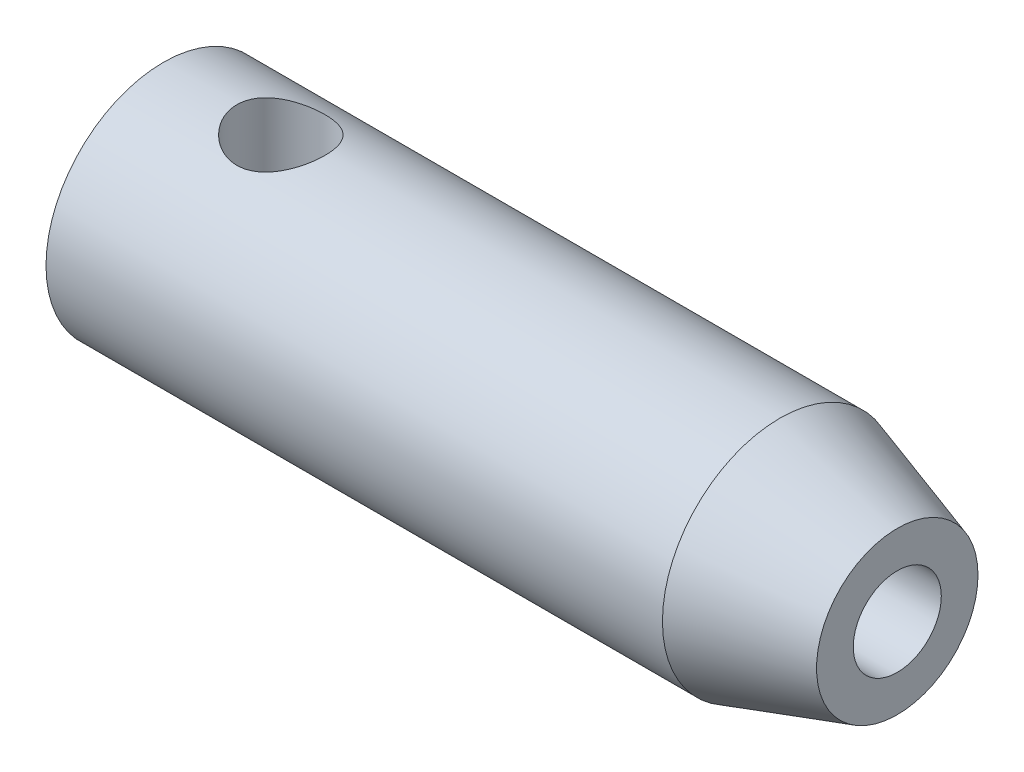
ISO-10303-21;
HEADER;
FILE_DESCRIPTION(('STEP AP214'),'2;1');
FILE_NAME('part.step','',(''),(''),'','','');
FILE_SCHEMA(('AUTOMOTIVE_DESIGN { 1 0 10303 214 1 1 1 1 }'));
ENDSEC;
DATA;
#1=APPLICATION_CONTEXT('core data for automotive mechanical design processes');
#2=APPLICATION_PROTOCOL_DEFINITION('international standard','automotive_design',2000,#1);
#3=PRODUCT_CONTEXT('',#1,'mechanical');
#4=PRODUCT('Part','Part','',(#3));
#5=PRODUCT_RELATED_PRODUCT_CATEGORY('part','',(#4));
#6=PRODUCT_DEFINITION_FORMATION('','',#4);
#7=PRODUCT_DEFINITION_CONTEXT('part definition',#1,'design');
#8=PRODUCT_DEFINITION('design','',#6,#7);
#9=PRODUCT_DEFINITION_SHAPE('','',#8);
#10=(LENGTH_UNIT() NAMED_UNIT(*) SI_UNIT(.MILLI.,.METRE.));
#11=(NAMED_UNIT(*) PLANE_ANGLE_UNIT() SI_UNIT($,.RADIAN.));
#12=(NAMED_UNIT(*) SI_UNIT($,.STERADIAN.) SOLID_ANGLE_UNIT());
#13=UNCERTAINTY_MEASURE_WITH_UNIT(LENGTH_MEASURE(1.E-05),#10,'distance_accuracy_value','');
#14=(GEOMETRIC_REPRESENTATION_CONTEXT(3) GLOBAL_UNCERTAINTY_ASSIGNED_CONTEXT((#13)) GLOBAL_UNIT_ASSIGNED_CONTEXT((#10,
#11,#12)) REPRESENTATION_CONTEXT('',''));
#15=CARTESIAN_POINT('',(0.,0.,0.));
#16=DIRECTION('',(0.,0.,1.));
#17=DIRECTION('',(1.,0.,0.));
#18=AXIS2_PLACEMENT_3D('',#15,#16,#17);
#19=CARTESIAN_POINT('',(25.,0.,0.));
#20=DIRECTION('',(1.,0.,0.));
#21=DIRECTION('',(0.,0.,-1.));
#22=AXIS2_PLACEMENT_3D('',#19,#20,#21);
#23=CYLINDRICAL_SURFACE('',#22,4.);
#24=CARTESIAN_POINT('',(21.,0.,0.));
#25=DIRECTION('',(1.,0.,0.));
#26=DIRECTION('',(0.,0.,-1.));
#27=AXIS2_PLACEMENT_3D('',#24,#25,#26);
#28=CIRCLE('',#27,4.);
#29=CARTESIAN_POINT('',(21.,0.,-4.));
#30=VERTEX_POINT('',#29);
#31=EDGE_CURVE('E84',#30,#30,#28,.T.);
#32=ORIENTED_EDGE('',*,*,#31,.F.);
#33=EDGE_LOOP('',(#32));
#34=FACE_BOUND('',#33,.T.);
#35=CARTESIAN_POINT('',(0.,0.,0.));
#36=DIRECTION('',(1.,0.,0.));
#37=DIRECTION('',(0.,0.,-1.));
#38=AXIS2_PLACEMENT_3D('',#35,#36,#37);
#39=CIRCLE('',#38,4.);
#40=CARTESIAN_POINT('',(0.,0.,-4.));
#41=VERTEX_POINT('',#40);
#42=EDGE_CURVE('E51',#41,#41,#39,.T.);
#43=ORIENTED_EDGE('',*,*,#42,.T.);
#44=EDGE_LOOP('',(#43));
#45=FACE_BOUND('',#44,.T.);
#46=CARTESIAN_POINT('',(4.,3.70809924354783,-1.5));
#47=CARTESIAN_POINT('',(3.91899251627921,3.70809640633806,-1.50000304106109));
#48=CARTESIAN_POINT('',(3.83800507749636,3.71078260240986,-1.49341597549487));
#49=CARTESIAN_POINT('',(3.6784719170868,3.72116159304967,-1.46736187895468));
#50=CARTESIAN_POINT('',(3.59992612240499,3.72885423767112,-1.44789523373263));
#51=CARTESIAN_POINT('',(3.44762462838647,3.748254802809,-1.39689657610574));
#52=CARTESIAN_POINT('',(3.37385794334892,3.7599530956926,-1.36539347266348));
#53=CARTESIAN_POINT('',(3.23262810318116,3.78603134206598,-1.29131856742698));
#54=CARTESIAN_POINT('',(3.16516684971748,3.80041210067323,-1.24874344095039));
#55=CARTESIAN_POINT('',(3.03510968837718,3.83103574665713,-1.15146661374162));
#56=CARTESIAN_POINT('',(2.97287147037061,3.84733341923603,-1.09630381213306));
#57=CARTESIAN_POINT('',(2.85827718532851,3.87949750628547,-0.976395839778926));
#58=CARTESIAN_POINT('',(2.80592322625815,3.89536382814785,-0.911648630256679));
#59=CARTESIAN_POINT('',(2.71086048770439,3.92552873936553,-0.7716946551776));
#60=CARTESIAN_POINT('',(2.66854052528414,3.93975561223505,-0.696206947538027));
#61=CARTESIAN_POINT('',(2.59734882747509,3.96438007973848,-0.538555771965247));
#62=CARTESIAN_POINT('',(2.56847242800803,3.97477900217006,-0.456394630933535));
#63=CARTESIAN_POINT('',(2.52624210422538,3.9901869710344,-0.291489341676831));
#64=CARTESIAN_POINT('',(2.51227237255954,3.99540915214774,-0.208923197281596));
#65=CARTESIAN_POINT('',(2.49827879905501,4.0006401410794,-0.0424643637947856));
#66=CARTESIAN_POINT('',(2.49825042238129,4.00065064414902,0.0414278850628334));
#67=CARTESIAN_POINT('',(2.51178176146517,3.99559265903894,0.203743543064476));
#68=CARTESIAN_POINT('',(2.52466929794882,3.99077541996683,0.2822321782669));
#69=CARTESIAN_POINT('',(2.56253591522555,3.97693274932263,0.435839217984391));
#70=CARTESIAN_POINT('',(2.58751585226204,3.96790701975578,0.510957383430298));
#71=CARTESIAN_POINT('',(2.64917045167585,3.94637769167531,0.656989017303104));
#72=CARTESIAN_POINT('',(2.68601000526841,3.93382539470077,0.727825392287309));
#73=CARTESIAN_POINT('',(2.77019209692939,3.90651310225279,0.862486607957559));
#74=CARTESIAN_POINT('',(2.8175380230176,3.8917523951284,0.926309176932323));
#75=CARTESIAN_POINT('',(2.92462728628319,3.86052529655816,1.04909048680094));
#76=CARTESIAN_POINT('',(2.98493391565043,3.84400963763883,1.10754614526348));
#77=CARTESIAN_POINT('',(3.11459299332156,3.81182460645722,1.21370395569342));
#78=CARTESIAN_POINT('',(3.18394770658664,3.79615544748847,1.261403406929));
#79=CARTESIAN_POINT('',(3.33171946746282,3.76712703500335,1.34565611808151));
#80=CARTESIAN_POINT('',(3.41030349368607,3.75382677150277,1.38193847851831));
#81=CARTESIAN_POINT('',(3.57309622516757,3.73172438629002,1.44056464441501));
#82=CARTESIAN_POINT('',(3.65730177159369,3.72291976205783,1.46291620605595));
#83=CARTESIAN_POINT('',(3.82397596231595,3.71139597222848,1.49190191709668));
#84=CARTESIAN_POINT('',(3.90628410553614,3.70836785241537,1.49933521158966));
#85=CARTESIAN_POINT('',(4.07100935674174,3.70786539525016,1.50057885636272));
#86=CARTESIAN_POINT('',(4.15342643235247,3.71038967003987,1.49439261093762));
#87=CARTESIAN_POINT('',(4.31192992228768,3.72039381629735,1.46929733520157));
#88=CARTESIAN_POINT('',(4.38813113576466,3.72763276216449,1.45100618334224));
#89=CARTESIAN_POINT('',(4.53634794472019,3.74596487046361,1.40299774640637));
#90=CARTESIAN_POINT('',(4.60836267916813,3.75705882250173,1.37327812034623));
#91=CARTESIAN_POINT('',(4.74916443807621,3.7823624311608,1.30200292275278));
#92=CARTESIAN_POINT('',(4.81772929213734,3.79667328892065,1.26004545177047));
#93=CARTESIAN_POINT('',(4.94712898172604,3.82662814294291,1.16591317862479));
#94=CARTESIAN_POINT('',(5.00796097462463,3.84227262594077,1.11373463696435));
#95=CARTESIAN_POINT('',(5.1241683731951,3.87433046553184,0.996727340900938));
#96=CARTESIAN_POINT('',(5.17895340876875,3.89072969357027,0.931306341491062));
#97=CARTESIAN_POINT('',(5.27683836758944,3.92149874963302,0.791797471753151));
#98=CARTESIAN_POINT('',(5.31993825294584,3.93586857107664,0.717709573322673));
#99=CARTESIAN_POINT('',(5.39294605619961,3.96094985704552,0.563016329468477));
#100=CARTESIAN_POINT('',(5.4228991237926,3.9716738133801,0.482434433064627));
#101=CARTESIAN_POINT('',(5.46865641384992,3.98829436712571,0.316881887523255));
#102=CARTESIAN_POINT('',(5.4844672854224,3.99419323299412,0.231913320723593));
#103=CARTESIAN_POINT('',(5.50077440275482,4.00028407317073,0.0653355852738155));
#104=CARTESIAN_POINT('',(5.50210948305899,4.00078860953764,-0.0161807680608453));
#105=CARTESIAN_POINT('',(5.49158484055461,3.99684889809223,-0.178226786412424));
#106=CARTESIAN_POINT('',(5.47972670911414,3.9924052471313,-0.258756569245257));
#107=CARTESIAN_POINT('',(5.44374114850638,3.97921089603771,-0.414548248377126));
#108=CARTESIAN_POINT('',(5.41992009412164,3.97056791378017,-0.489890731068835));
#109=CARTESIAN_POINT('',(5.36098998661564,3.9498778362099,-0.63551547300639));
#110=CARTESIAN_POINT('',(5.32587879669525,3.93783009655664,-0.705796771275542));
#111=CARTESIAN_POINT('',(5.24368605649519,3.91090618300074,-0.842540176994412));
#112=CARTESIAN_POINT('',(5.19616335948585,3.89593240108828,-0.908717548846849));
#113=CARTESIAN_POINT('',(5.09119216981239,3.86499507694844,-1.03241734752336));
#114=CARTESIAN_POINT('',(5.03374013419213,3.84903118274027,-1.0899366712559));
#115=CARTESIAN_POINT('',(4.90693586835494,3.81688129739175,-1.19781214236196));
#116=CARTESIAN_POINT('',(4.83711559784569,3.8007280534916,-1.24762999816025));
#117=CARTESIAN_POINT('',(4.68958413042667,3.77098325003638,-1.33484709556843));
#118=CARTESIAN_POINT('',(4.61187211594652,3.75739195631216,-1.37224504878157));
#119=CARTESIAN_POINT('',(4.44704431902459,3.73402269853266,-1.4346588697426));
#120=CARTESIAN_POINT('',(4.35966563348821,3.7244380329086,-1.45906002899523));
#121=CARTESIAN_POINT('',(4.18151472804421,3.71147994336315,-1.49172356722079));
#122=CARTESIAN_POINT('',(4.09074478729001,3.70810242179736,-1.4999965933957));
#123=CARTESIAN_POINT('',(4.,3.70809924354783,-1.5));
#124=B_SPLINE_CURVE_WITH_KNOTS('',3,(#46,#47,#48,#49,#50,#51,#52,#53,#54,#55,#56,#57,#58,#59,
#60,#61,#62,#63,#64,#65,#66,#67,#68,#69,#70,#71,#72,#73,#74,#75,#76,#77,#78,#79,#80,#81,#82,#83,
#84,#85,#86,#87,#88,#89,#90,#91,#92,#93,#94,#95,#96,#97,#98,#99,#100,#101,#102,#103,#104,#105,
#106,#107,#108,#109,#110,#111,#112,#113,#114,#115,#116,#117,#118,#119,#120,#121,#122,#123),
.UNSPECIFIED.,.T.,.F.,(4,2,2,2,2,2,2,2,2,2,2,2,2,2,2,2,2,2,2,2,2,2,2,2,2,2,2,2,2,2,2,2,2,2,2,2,
2,2,4),(0.,0.242684541416171,0.485361814598854,0.72745985675703,0.969630679682933,
1.22274652401128,1.47591628822983,1.73770072136421,1.9993942638133,2.24980018489679,
2.50012465404857,2.73806472803194,2.97602165263335,3.21744131210668,3.45893893628976,
3.71456675065874,3.97025867827334,4.23162592252966,4.49284751635474,4.73965657740485,
4.98640395388884,5.22143845928198,5.45652113429526,5.70041561005821,5.94439948466355,
6.20385016993624,6.46330169650177,6.72185508890168,6.98028685560126,7.22365720549935,
7.46699820319479,7.7044027400389,7.94185223512831,8.18928323676986,8.43680270894964,
8.69738599542079,8.95799630544242,9.23003178870926,9.50188762323053),.UNSPECIFIED.);
#125=CARTESIAN_POINT('',(4.,3.70809924354783,-1.5));
#126=VERTEX_POINT('',#125);
#127=EDGE_CURVE('E94',#126,#126,#124,.T.);
#128=ORIENTED_EDGE('',*,*,#127,.F.);
#129=EDGE_LOOP('',(#128));
#130=FACE_BOUND('',#129,.T.);
#131=ADVANCED_FACE('F34',(#34,#45,#130),#23,.T.);
#132=CARTESIAN_POINT('',(25.,0.,0.));
#133=DIRECTION('',(-1.,0.,0.));
#134=DIRECTION('',(0.,0.,1.));
#135=AXIS2_PLACEMENT_3D('',#132,#133,#134);
#136=CYLINDRICAL_SURFACE('',#135,1.5);
#137=CARTESIAN_POINT('',(25.,0.,0.));
#138=DIRECTION('',(1.,0.,0.));
#139=DIRECTION('',(0.,0.,-1.));
#140=AXIS2_PLACEMENT_3D('',#137,#138,#139);
#141=CIRCLE('',#140,1.5);
#142=CARTESIAN_POINT('',(25.,0.,-1.5));
#143=VERTEX_POINT('',#142);
#144=EDGE_CURVE('E80',#143,#143,#141,.T.);
#145=ORIENTED_EDGE('',*,*,#144,.T.);
#146=EDGE_LOOP('',(#145));
#147=FACE_BOUND('',#146,.T.);
#148=CARTESIAN_POINT('',(0.,0.,0.));
#149=DIRECTION('',(1.,0.,0.));
#150=DIRECTION('',(0.,0.,-1.));
#151=AXIS2_PLACEMENT_3D('',#148,#149,#150);
#152=CIRCLE('',#151,1.5);
#153=CARTESIAN_POINT('',(0.,0.,-1.5));
#154=VERTEX_POINT('',#153);
#155=EDGE_CURVE('E91',#154,#154,#152,.T.);
#156=ORIENTED_EDGE('',*,*,#155,.F.);
#157=EDGE_LOOP('',(#156));
#158=FACE_BOUND('',#157,.T.);
#159=CARTESIAN_POINT('',(4.,0.,0.));
#160=DIRECTION('',(-0.707106781186547,0.707106781186547,0.));
#161=DIRECTION('',(-0.707106781186547,-0.707106781186547,0.));
#162=AXIS2_PLACEMENT_3D('',#159,#160,#161);
#163=ELLIPSE('',#162,2.12132034355964,1.5);
#164=CARTESIAN_POINT('',(4.,0.,1.5));
#165=VERTEX_POINT('',#164);
#166=CARTESIAN_POINT('',(4.,0.,-1.5));
#167=VERTEX_POINT('',#166);
#168=EDGE_CURVE('E42',#165,#167,#163,.T.);
#169=ORIENTED_EDGE('',*,*,#168,.T.);
#170=CARTESIAN_POINT('',(4.,0.,0.));
#171=DIRECTION('',(-0.707106781186547,-0.707106781186547,0.));
#172=DIRECTION('',(-0.707106781186547,0.707106781186547,0.));
#173=AXIS2_PLACEMENT_3D('',#170,#171,#172);
#174=ELLIPSE('',#173,2.12132034355964,1.5);
#175=EDGE_CURVE('E11',#167,#165,#174,.F.);
#176=ORIENTED_EDGE('',*,*,#175,.T.);
#177=EDGE_LOOP('',(#169,#176));
#178=FACE_BOUND('',#177,.T.);
#179=ADVANCED_FACE('F52',(#147,#158,#178),#136,.F.);
#180=CARTESIAN_POINT('',(0.,0.,0.));
#181=DIRECTION('',(1.,0.,0.));
#182=DIRECTION('',(0.,0.,-1.));
#183=AXIS2_PLACEMENT_3D('',#180,#181,#182);
#184=PLANE('',#183);
#185=ORIENTED_EDGE('',*,*,#155,.T.);
#186=EDGE_LOOP('',(#185));
#187=FACE_BOUND('',#186,.T.);
#188=ORIENTED_EDGE('',*,*,#42,.F.);
#189=EDGE_LOOP('',(#188));
#190=FACE_BOUND('',#189,.T.);
#191=ADVANCED_FACE('F54',(#187,#190),#184,.F.);
#192=CARTESIAN_POINT('',(25.,0.,0.));
#193=DIRECTION('',(1.,0.,0.));
#194=DIRECTION('',(0.,0.,-1.));
#195=AXIS2_PLACEMENT_3D('',#192,#193,#194);
#196=PLANE('',#195);
#197=ORIENTED_EDGE('',*,*,#144,.F.);
#198=EDGE_LOOP('',(#197));
#199=FACE_BOUND('',#198,.T.);
#200=CARTESIAN_POINT('',(25.,0.,0.));
#201=DIRECTION('',(1.,0.,0.));
#202=DIRECTION('',(0.,0.,-1.));
#203=AXIS2_PLACEMENT_3D('',#200,#201,#202);
#204=CIRCLE('',#203,2.75);
#205=CARTESIAN_POINT('',(25.,0.,-2.75));
#206=VERTEX_POINT('',#205);
#207=EDGE_CURVE('E83',#206,#206,#204,.T.);
#208=ORIENTED_EDGE('',*,*,#207,.T.);
#209=EDGE_LOOP('',(#208));
#210=FACE_BOUND('',#209,.T.);
#211=ADVANCED_FACE('F62',(#199,#210),#196,.T.);
#212=CARTESIAN_POINT('',(21.,0.,0.));
#213=DIRECTION('',(-1.,0.,0.));
#214=DIRECTION('',(0.,0.,1.));
#215=AXIS2_PLACEMENT_3D('',#212,#213,#214);
#216=CONICAL_SURFACE('',#215,4.,0.302884868374972);
#217=ORIENTED_EDGE('',*,*,#207,.F.);
#218=EDGE_LOOP('',(#217));
#219=FACE_BOUND('',#218,.T.);
#220=ORIENTED_EDGE('',*,*,#31,.T.);
#221=EDGE_LOOP('',(#220));
#222=FACE_BOUND('',#221,.T.);
#223=ADVANCED_FACE('F70',(#219,#222),#216,.T.);
#224=CARTESIAN_POINT('',(4.,10.,0.));
#225=DIRECTION('',(0.,-1.,0.));
#226=DIRECTION('',(0.,0.,-1.));
#227=AXIS2_PLACEMENT_3D('',#224,#225,#226);
#228=CYLINDRICAL_SURFACE('',#227,1.5);
#229=ORIENTED_EDGE('',*,*,#168,.F.);
#230=ORIENTED_EDGE('',*,*,#175,.F.);
#231=EDGE_LOOP('',(#229,#230));
#232=FACE_BOUND('',#231,.T.);
#233=ORIENTED_EDGE('',*,*,#127,.T.);
#234=EDGE_LOOP('',(#233));
#235=FACE_BOUND('',#234,.T.);
#236=ADVANCED_FACE('F48',(#232,#235),#228,.F.);
#237=CLOSED_SHELL('',(#131,#179,#191,#211,#223,#236));
#238=MANIFOLD_SOLID_BREP('B2',#237);
#239=ADVANCED_BREP_SHAPE_REPRESENTATION('',(#18,#238),#14);
#240=SHAPE_DEFINITION_REPRESENTATION(#9,#239);
ENDSEC;
END-ISO-10303-21;
